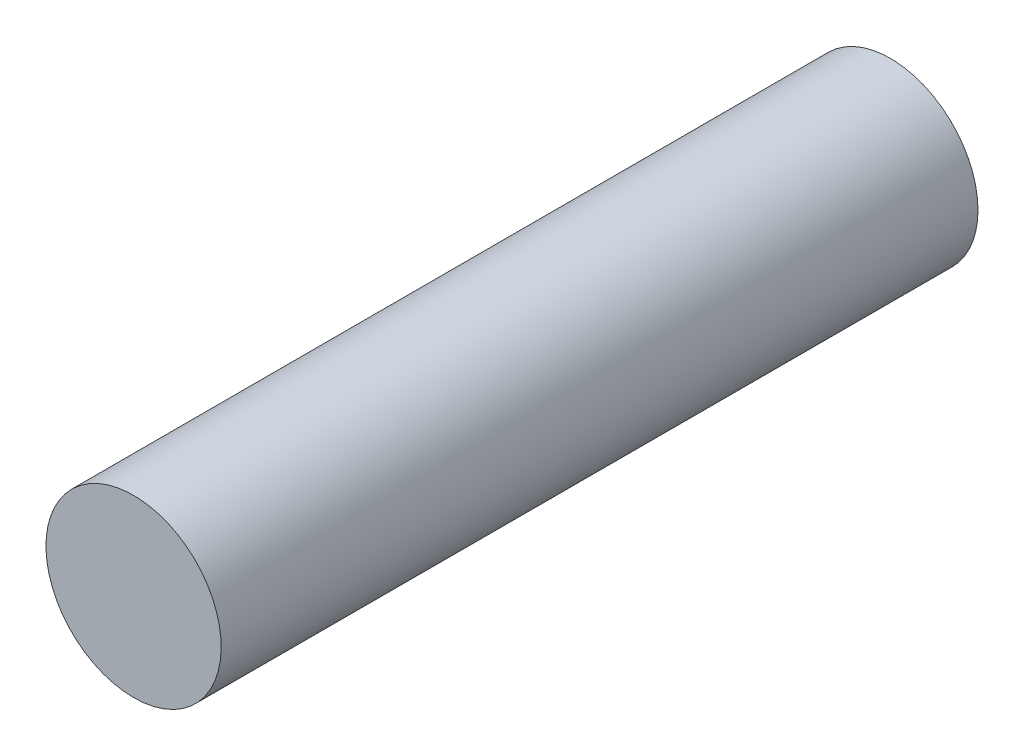
ISO-10303-21;
HEADER;
FILE_DESCRIPTION(('STEP AP214'),'2;1');
FILE_NAME('part.step','',(''),(''),'','','');
FILE_SCHEMA(('AUTOMOTIVE_DESIGN { 1 0 10303 214 1 1 1 1 }'));
ENDSEC;
DATA;
#1=APPLICATION_CONTEXT('core data for automotive mechanical design processes');
#2=APPLICATION_PROTOCOL_DEFINITION('international standard','automotive_design',2000,#1);
#3=PRODUCT_CONTEXT('',#1,'mechanical');
#4=PRODUCT('Part','Part','',(#3));
#5=PRODUCT_RELATED_PRODUCT_CATEGORY('part','',(#4));
#6=PRODUCT_DEFINITION_FORMATION('','',#4);
#7=PRODUCT_DEFINITION_CONTEXT('part definition',#1,'design');
#8=PRODUCT_DEFINITION('design','',#6,#7);
#9=PRODUCT_DEFINITION_SHAPE('','',#8);
#10=(LENGTH_UNIT() NAMED_UNIT(*) SI_UNIT(.MILLI.,.METRE.));
#11=(NAMED_UNIT(*) PLANE_ANGLE_UNIT() SI_UNIT($,.RADIAN.));
#12=(NAMED_UNIT(*) SI_UNIT($,.STERADIAN.) SOLID_ANGLE_UNIT());
#13=UNCERTAINTY_MEASURE_WITH_UNIT(LENGTH_MEASURE(1.E-05),#10,'distance_accuracy_value','');
#14=(GEOMETRIC_REPRESENTATION_CONTEXT(3) GLOBAL_UNCERTAINTY_ASSIGNED_CONTEXT((#13)) GLOBAL_UNIT_ASSIGNED_CONTEXT((#10,
#11,#12)) REPRESENTATION_CONTEXT('',''));
#15=CARTESIAN_POINT('',(0.,0.,0.));
#16=DIRECTION('',(0.,0.,1.));
#17=DIRECTION('',(1.,0.,0.));
#18=AXIS2_PLACEMENT_3D('',#15,#16,#17);
#19=CARTESIAN_POINT('',(5.44999999999901,10.5000000000004,40.));
#20=DIRECTION('',(0.,0.,-1.));
#21=DIRECTION('',(-1.,0.,0.));
#22=AXIS2_PLACEMENT_3D('',#19,#20,#21);
#23=CYLINDRICAL_SURFACE('',#22,5.);
#24=CARTESIAN_POINT('',(5.44999999999901,10.5000000000004,0.));
#25=DIRECTION('',(0.,0.,1.));
#26=DIRECTION('',(1.,0.,0.));
#27=AXIS2_PLACEMENT_3D('',#24,#25,#26);
#28=CIRCLE('',#27,5.);
#29=CARTESIAN_POINT('',(10.449999999999,10.5000000000004,0.));
#30=VERTEX_POINT('',#29);
#31=EDGE_CURVE('E10',#30,#30,#28,.T.);
#32=ORIENTED_EDGE('',*,*,#31,.T.);
#33=EDGE_LOOP('',(#32));
#34=FACE_BOUND('',#33,.T.);
#35=CARTESIAN_POINT('',(5.44999999999901,10.5000000000004,43.1999999999998));
#36=DIRECTION('',(0.,0.,1.));
#37=DIRECTION('',(0.,-1.,0.));
#38=AXIS2_PLACEMENT_3D('',#35,#36,#37);
#39=CIRCLE('',#38,5.);
#40=CARTESIAN_POINT('',(5.44999999999901,5.50000000000037,43.1999999999998));
#41=VERTEX_POINT('',#40);
#42=EDGE_CURVE('E54',#41,#41,#39,.T.);
#43=ORIENTED_EDGE('',*,*,#42,.F.);
#44=EDGE_LOOP('',(#43));
#45=FACE_BOUND('',#44,.T.);
#46=ADVANCED_FACE('F47',(#34,#45),#23,.T.);
#47=CARTESIAN_POINT('',(0.,0.,0.));
#48=DIRECTION('',(0.,0.,1.));
#49=DIRECTION('',(1.,0.,0.));
#50=AXIS2_PLACEMENT_3D('',#47,#48,#49);
#51=PLANE('',#50);
#52=ORIENTED_EDGE('',*,*,#31,.F.);
#53=EDGE_LOOP('',(#52));
#54=FACE_BOUND('',#53,.T.);
#55=ADVANCED_FACE('F66',(#54),#51,.F.);
#56=CARTESIAN_POINT('',(-45.2652250420784,-28.5380064671779,43.1999999999998));
#57=DIRECTION('',(0.,0.,1.));
#58=DIRECTION('',(0.792425391282458,0.60996885104966,0.));
#59=AXIS2_PLACEMENT_3D('',#56,#57,#58);
#60=PLANE('',#59);
#61=ORIENTED_EDGE('',*,*,#42,.T.);
#62=EDGE_LOOP('',(#61));
#63=FACE_BOUND('',#62,.T.);
#64=ADVANCED_FACE('F63',(#63),#60,.T.);
#65=CLOSED_SHELL('',(#46,#55,#64));
#66=MANIFOLD_SOLID_BREP('B2',#65);
#67=ADVANCED_BREP_SHAPE_REPRESENTATION('',(#18,#66),#14);
#68=SHAPE_DEFINITION_REPRESENTATION(#9,#67);
ENDSEC;
END-ISO-10303-21;
